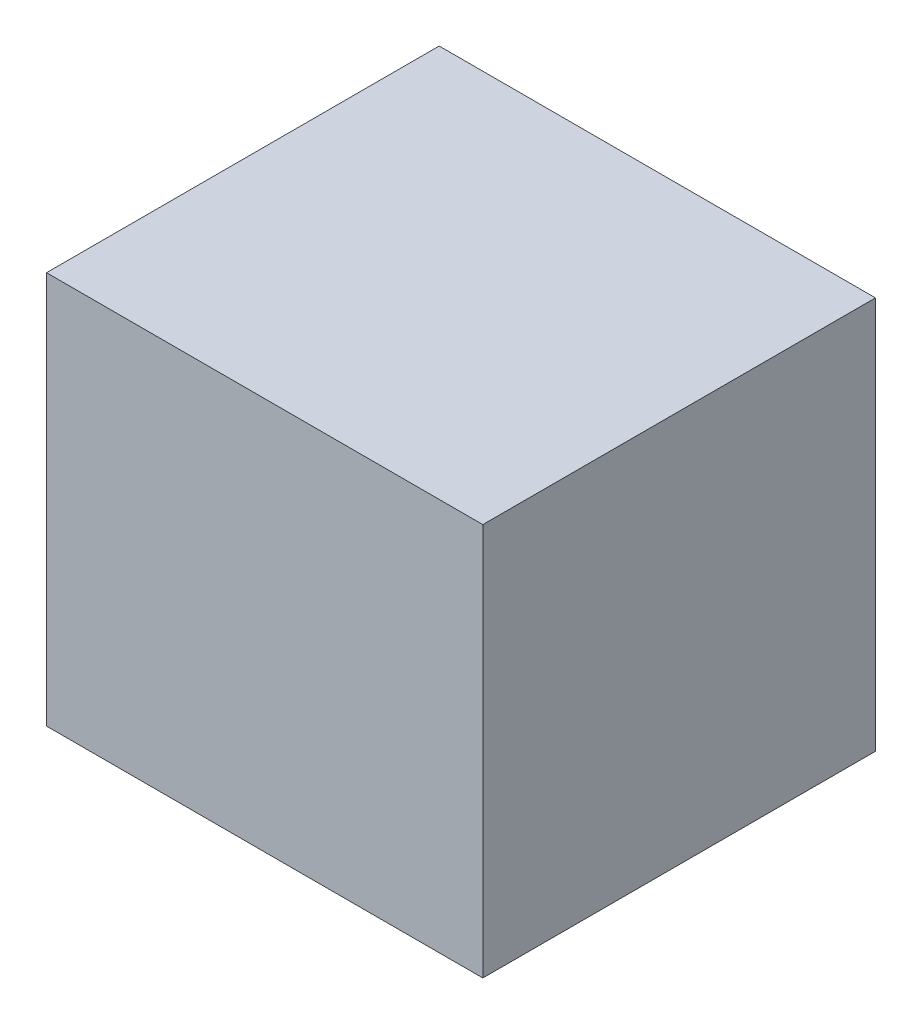
ISO-10303-21;
HEADER;
FILE_DESCRIPTION(('STEP AP214'),'2;1');
FILE_NAME('part.step','',(''),(''),'','','');
FILE_SCHEMA(('AUTOMOTIVE_DESIGN { 1 0 10303 214 1 1 1 1 }'));
ENDSEC;
DATA;
#1=APPLICATION_CONTEXT('core data for automotive mechanical design processes');
#2=APPLICATION_PROTOCOL_DEFINITION('international standard','automotive_design',2000,#1);
#3=PRODUCT_CONTEXT('',#1,'mechanical');
#4=PRODUCT('Part','Part','',(#3));
#5=PRODUCT_RELATED_PRODUCT_CATEGORY('part','',(#4));
#6=PRODUCT_DEFINITION_FORMATION('','',#4);
#7=PRODUCT_DEFINITION_CONTEXT('part definition',#1,'design');
#8=PRODUCT_DEFINITION('design','',#6,#7);
#9=PRODUCT_DEFINITION_SHAPE('','',#8);
#10=(LENGTH_UNIT() NAMED_UNIT(*) SI_UNIT(.MILLI.,.METRE.));
#11=(NAMED_UNIT(*) PLANE_ANGLE_UNIT() SI_UNIT($,.RADIAN.));
#12=(NAMED_UNIT(*) SI_UNIT($,.STERADIAN.) SOLID_ANGLE_UNIT());
#13=UNCERTAINTY_MEASURE_WITH_UNIT(LENGTH_MEASURE(1.E-05),#10,'distance_accuracy_value','');
#14=(GEOMETRIC_REPRESENTATION_CONTEXT(3) GLOBAL_UNCERTAINTY_ASSIGNED_CONTEXT((#13)) GLOBAL_UNIT_ASSIGNED_CONTEXT((#10,
#11,#12)) REPRESENTATION_CONTEXT('',''));
#15=CARTESIAN_POINT('',(0.,0.,0.));
#16=DIRECTION('',(0.,0.,1.));
#17=DIRECTION('',(1.,0.,0.));
#18=AXIS2_PLACEMENT_3D('',#15,#16,#17);
#19=CARTESIAN_POINT('',(-0.999998,-0.8999982,0.));
#20=DIRECTION('',(0.,1.,0.));
#21=DIRECTION('',(0.,0.,1.));
#22=AXIS2_PLACEMENT_3D('',#19,#20,#21);
#23=PLANE('',#22);
#24=DIRECTION('',(0.,0.,1.));
#25=VECTOR('',#24,1.);
#26=CARTESIAN_POINT('',(1.00000054,-0.8999982,0.));
#27=LINE('',#26,#25);
#28=CARTESIAN_POINT('',(1.00000054,-0.8999982,0.));
#29=VERTEX_POINT('',#28);
#30=CARTESIAN_POINT('',(1.00000054,-0.8999982,1.79999894));
#31=VERTEX_POINT('',#30);
#32=EDGE_CURVE('E20',#29,#31,#27,.T.);
#33=ORIENTED_EDGE('',*,*,#32,.T.);
#34=DIRECTION('',(-1.,0.,0.));
#35=VECTOR('',#34,1.);
#36=CARTESIAN_POINT('',(1.00000054,-0.8999982,1.79999894));
#37=LINE('',#36,#35);
#38=CARTESIAN_POINT('',(-0.999998,-0.8999982,1.79999894));
#39=VERTEX_POINT('',#38);
#40=EDGE_CURVE('E55',#31,#39,#37,.T.);
#41=ORIENTED_EDGE('',*,*,#40,.T.);
#42=DIRECTION('',(0.,0.,-1.));
#43=VECTOR('',#42,1.);
#44=CARTESIAN_POINT('',(-0.999998,-0.8999982,0.));
#45=LINE('',#44,#43);
#46=CARTESIAN_POINT('',(-0.999998,-0.8999982,0.));
#47=VERTEX_POINT('',#46);
#48=EDGE_CURVE('E74',#39,#47,#45,.T.);
#49=ORIENTED_EDGE('',*,*,#48,.T.);
#50=DIRECTION('',(-1.,0.,0.));
#51=VECTOR('',#50,1.);
#52=CARTESIAN_POINT('',(1.00000054,-0.8999982,0.));
#53=LINE('',#52,#51);
#54=EDGE_CURVE('E66',#29,#47,#53,.T.);
#55=ORIENTED_EDGE('',*,*,#54,.F.);
#56=EDGE_LOOP('',(#33,#41,#49,#55));
#57=FACE_BOUND('',#56,.T.);
#58=ADVANCED_FACE('F17',(#57),#23,.F.);
#59=CARTESIAN_POINT('',(1.00000054,-0.8999982,0.));
#60=DIRECTION('',(-1.,0.,0.));
#61=DIRECTION('',(0.,0.,1.));
#62=AXIS2_PLACEMENT_3D('',#59,#60,#61);
#63=PLANE('',#62);
#64=DIRECTION('',(0.,0.,-1.));
#65=VECTOR('',#64,1.);
#66=CARTESIAN_POINT('',(1.00000054,0.90000074,0.));
#67=LINE('',#66,#65);
#68=CARTESIAN_POINT('',(1.00000054,0.90000074,0.));
#69=VERTEX_POINT('',#68);
#70=CARTESIAN_POINT('',(1.00000054,0.90000074,1.79999894));
#71=VERTEX_POINT('',#70);
#72=EDGE_CURVE('E72',#69,#71,#67,.F.);
#73=ORIENTED_EDGE('',*,*,#72,.T.);
#74=DIRECTION('',(0.,1.,0.));
#75=VECTOR('',#74,1.);
#76=CARTESIAN_POINT('',(1.00000054,-0.8999982,1.79999894));
#77=LINE('',#76,#75);
#78=EDGE_CURVE('E62',#71,#31,#77,.F.);
#79=ORIENTED_EDGE('',*,*,#78,.T.);
#80=ORIENTED_EDGE('',*,*,#32,.F.);
#81=DIRECTION('',(0.,1.,0.));
#82=VECTOR('',#81,1.);
#83=CARTESIAN_POINT('',(1.00000054,-0.8999982,0.));
#84=LINE('',#83,#82);
#85=EDGE_CURVE('E80',#69,#29,#84,.F.);
#86=ORIENTED_EDGE('',*,*,#85,.F.);
#87=EDGE_LOOP('',(#73,#79,#80,#86));
#88=FACE_BOUND('',#87,.T.);
#89=ADVANCED_FACE('F71',(#88),#63,.F.);
#90=CARTESIAN_POINT('',(1.00000054,-0.8999982,1.79999894));
#91=DIRECTION('',(0.,0.,-1.));
#92=DIRECTION('',(-1.,0.,0.));
#93=AXIS2_PLACEMENT_3D('',#90,#91,#92);
#94=PLANE('',#93);
#95=DIRECTION('',(1.,0.,0.));
#96=VECTOR('',#95,1.);
#97=CARTESIAN_POINT('',(1.00000054,0.90000074,1.79999894));
#98=LINE('',#97,#96);
#99=CARTESIAN_POINT('',(-0.999998,0.90000074,1.79999894));
#100=VERTEX_POINT('',#99);
#101=EDGE_CURVE('E83',#71,#100,#98,.F.);
#102=ORIENTED_EDGE('',*,*,#101,.T.);
#103=DIRECTION('',(0.,1.,0.));
#104=VECTOR('',#103,1.);
#105=CARTESIAN_POINT('',(-0.999998,0.90000074,1.79999894));
#106=LINE('',#105,#104);
#107=EDGE_CURVE('E64',#100,#39,#106,.F.);
#108=ORIENTED_EDGE('',*,*,#107,.T.);
#109=ORIENTED_EDGE('',*,*,#40,.F.);
#110=ORIENTED_EDGE('',*,*,#78,.F.);
#111=EDGE_LOOP('',(#102,#108,#109,#110));
#112=FACE_BOUND('',#111,.T.);
#113=ADVANCED_FACE('F60',(#112),#94,.F.);
#114=CARTESIAN_POINT('',(-0.999998,0.90000074,0.));
#115=DIRECTION('',(1.,0.,0.));
#116=DIRECTION('',(0.,0.,-1.));
#117=AXIS2_PLACEMENT_3D('',#114,#115,#116);
#118=PLANE('',#117);
#119=ORIENTED_EDGE('',*,*,#48,.F.);
#120=ORIENTED_EDGE('',*,*,#107,.F.);
#121=DIRECTION('',(0.,0.,-1.));
#122=VECTOR('',#121,1.);
#123=CARTESIAN_POINT('',(-0.999998,0.90000074,0.));
#124=LINE('',#123,#122);
#125=CARTESIAN_POINT('',(-0.999998,0.90000074,0.));
#126=VERTEX_POINT('',#125);
#127=EDGE_CURVE('E26',#100,#126,#124,.T.);
#128=ORIENTED_EDGE('',*,*,#127,.T.);
#129=DIRECTION('',(0.,1.,0.));
#130=VECTOR('',#129,1.);
#131=CARTESIAN_POINT('',(-0.999998,-0.8999982,0.));
#132=LINE('',#131,#130);
#133=EDGE_CURVE('E34',#47,#126,#132,.T.);
#134=ORIENTED_EDGE('',*,*,#133,.F.);
#135=EDGE_LOOP('',(#119,#120,#128,#134));
#136=FACE_BOUND('',#135,.T.);
#137=ADVANCED_FACE('F88',(#136),#118,.F.);
#138=CARTESIAN_POINT('',(1.00000054,-0.8999982,0.));
#139=DIRECTION('',(0.,0.,-1.));
#140=DIRECTION('',(-1.,0.,0.));
#141=AXIS2_PLACEMENT_3D('',#138,#139,#140);
#142=PLANE('',#141);
#143=DIRECTION('',(1.,0.,0.));
#144=VECTOR('',#143,1.);
#145=CARTESIAN_POINT('',(1.00000054,0.90000074,0.));
#146=LINE('',#145,#144);
#147=EDGE_CURVE('E11',#126,#69,#146,.T.);
#148=ORIENTED_EDGE('',*,*,#147,.T.);
#149=ORIENTED_EDGE('',*,*,#85,.T.);
#150=ORIENTED_EDGE('',*,*,#54,.T.);
#151=ORIENTED_EDGE('',*,*,#133,.T.);
#152=EDGE_LOOP('',(#148,#149,#150,#151));
#153=FACE_BOUND('',#152,.T.);
#154=ADVANCED_FACE('F91',(#153),#142,.T.);
#155=CARTESIAN_POINT('',(1.00000054,0.90000074,0.));
#156=DIRECTION('',(0.,-1.,0.));
#157=DIRECTION('',(0.,0.,-1.));
#158=AXIS2_PLACEMENT_3D('',#155,#156,#157);
#159=PLANE('',#158);
#160=ORIENTED_EDGE('',*,*,#127,.F.);
#161=ORIENTED_EDGE('',*,*,#101,.F.);
#162=ORIENTED_EDGE('',*,*,#72,.F.);
#163=ORIENTED_EDGE('',*,*,#147,.F.);
#164=EDGE_LOOP('',(#160,#161,#162,#163));
#165=FACE_BOUND('',#164,.T.);
#166=ADVANCED_FACE('F90',(#165),#159,.F.);
#167=CLOSED_SHELL('',(#58,#89,#113,#137,#154,#166));
#168=MANIFOLD_SOLID_BREP('B1',#167);
#169=ADVANCED_BREP_SHAPE_REPRESENTATION('',(#18,#168),#14);
#170=SHAPE_DEFINITION_REPRESENTATION(#9,#169);
ENDSEC;
END-ISO-10303-21;
